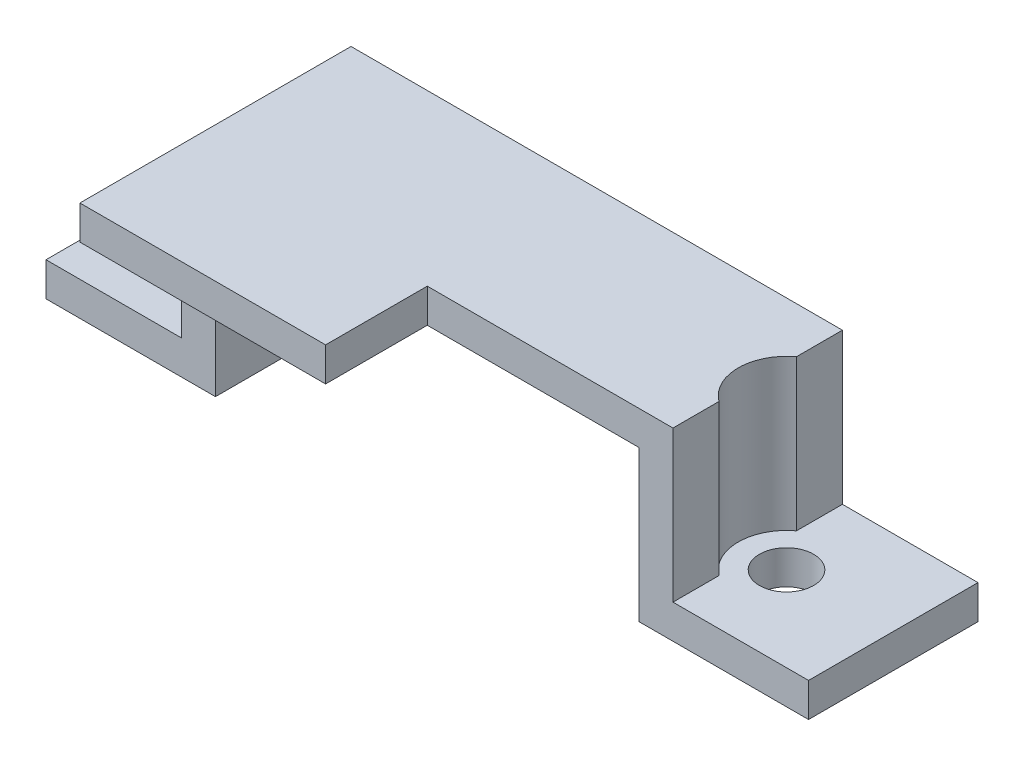
ISO-10303-21;
HEADER;
FILE_DESCRIPTION(('STEP AP214'),'2;1');
FILE_NAME('part.step','',(''),(''),'','','');
FILE_SCHEMA(('AUTOMOTIVE_DESIGN { 1 0 10303 214 1 1 1 1 }'));
ENDSEC;
DATA;
#1=APPLICATION_CONTEXT('core data for automotive mechanical design processes');
#2=APPLICATION_PROTOCOL_DEFINITION('international standard','automotive_design',2000,#1);
#3=PRODUCT_CONTEXT('',#1,'mechanical');
#4=PRODUCT('Part','Part','',(#3));
#5=PRODUCT_RELATED_PRODUCT_CATEGORY('part','',(#4));
#6=PRODUCT_DEFINITION_FORMATION('','',#4);
#7=PRODUCT_DEFINITION_CONTEXT('part definition',#1,'design');
#8=PRODUCT_DEFINITION('design','',#6,#7);
#9=PRODUCT_DEFINITION_SHAPE('','',#8);
#10=(LENGTH_UNIT() NAMED_UNIT(*) SI_UNIT(.MILLI.,.METRE.));
#11=(NAMED_UNIT(*) PLANE_ANGLE_UNIT() SI_UNIT($,.RADIAN.));
#12=(NAMED_UNIT(*) SI_UNIT($,.STERADIAN.) SOLID_ANGLE_UNIT());
#13=UNCERTAINTY_MEASURE_WITH_UNIT(LENGTH_MEASURE(1.E-05),#10,'distance_accuracy_value','');
#14=(GEOMETRIC_REPRESENTATION_CONTEXT(3) GLOBAL_UNCERTAINTY_ASSIGNED_CONTEXT((#13)) GLOBAL_UNIT_ASSIGNED_CONTEXT((#10,
#11,#12)) REPRESENTATION_CONTEXT('',''));
#15=CARTESIAN_POINT('',(0.,0.,0.));
#16=DIRECTION('',(0.,0.,1.));
#17=DIRECTION('',(1.,0.,0.));
#18=AXIS2_PLACEMENT_3D('',#15,#16,#17);
#19=CARTESIAN_POINT('',(15.,12.,10.));
#20=DIRECTION('',(1.,0.,0.));
#21=DIRECTION('',(0.,1.,0.));
#22=AXIS2_PLACEMENT_3D('',#19,#20,#21);
#23=PLANE('',#22);
#24=DIRECTION('',(0.,0.,-1.));
#25=VECTOR('',#24,1.);
#26=CARTESIAN_POINT('',(15.,3.1,10.));
#27=LINE('',#26,#25);
#28=CARTESIAN_POINT('',(15.,3.1,10.));
#29=VERTEX_POINT('',#28);
#30=CARTESIAN_POINT('',(15.,3.1,7.28746584673958));
#31=VERTEX_POINT('',#30);
#32=EDGE_CURVE('E174',#29,#31,#27,.T.);
#33=ORIENTED_EDGE('',*,*,#32,.T.);
#34=DIRECTION('',(0.,-1.,0.));
#35=VECTOR('',#34,1.);
#36=CARTESIAN_POINT('',(15.,20.0610173055266,7.28746584673958));
#37=LINE('',#36,#35);
#38=CARTESIAN_POINT('',(15.,12.,7.28746584673958));
#39=VERTEX_POINT('',#38);
#40=EDGE_CURVE('E158',#31,#39,#37,.F.);
#41=ORIENTED_EDGE('',*,*,#40,.T.);
#42=DIRECTION('',(0.,0.,-1.));
#43=VECTOR('',#42,1.);
#44=CARTESIAN_POINT('',(15.,12.,10.));
#45=LINE('',#44,#43);
#46=CARTESIAN_POINT('',(15.,12.,10.));
#47=VERTEX_POINT('',#46);
#48=EDGE_CURVE('E184',#47,#39,#45,.T.);
#49=ORIENTED_EDGE('',*,*,#48,.F.);
#50=DIRECTION('',(0.,-1.,0.));
#51=VECTOR('',#50,1.);
#52=CARTESIAN_POINT('',(15.,12.,10.));
#53=LINE('',#52,#51);
#54=EDGE_CURVE('E181',#47,#29,#53,.T.);
#55=ORIENTED_EDGE('',*,*,#54,.T.);
#56=EDGE_LOOP('',(#33,#41,#49,#55));
#57=FACE_BOUND('',#56,.T.);
#58=ADVANCED_FACE('F39',(#57),#23,.T.);
#59=CARTESIAN_POINT('',(15.,12.,2.71253415326043));
#60=VERTEX_POINT('',#59);
#61=CARTESIAN_POINT('',(15.,12.,0.));
#62=VERTEX_POINT('',#61);
#63=EDGE_CURVE('E187',#60,#62,#45,.T.);
#64=ORIENTED_EDGE('',*,*,#63,.F.);
#65=DIRECTION('',(0.,-1.,0.));
#66=VECTOR('',#65,1.);
#67=CARTESIAN_POINT('',(15.,20.0610173055266,2.71253415326043));
#68=LINE('',#67,#66);
#69=CARTESIAN_POINT('',(15.,3.1,2.71253415326042));
#70=VERTEX_POINT('',#69);
#71=EDGE_CURVE('E55',#60,#70,#68,.T.);
#72=ORIENTED_EDGE('',*,*,#71,.T.);
#73=CARTESIAN_POINT('',(15.,3.1,0.));
#74=VERTEX_POINT('',#73);
#75=EDGE_CURVE('E177',#70,#74,#27,.T.);
#76=ORIENTED_EDGE('',*,*,#75,.T.);
#77=DIRECTION('',(0.,-1.,0.));
#78=VECTOR('',#77,1.);
#79=CARTESIAN_POINT('',(15.,12.,0.));
#80=LINE('',#79,#78);
#81=EDGE_CURVE('E230',#62,#74,#80,.T.);
#82=ORIENTED_EDGE('',*,*,#81,.F.);
#83=EDGE_LOOP('',(#64,#72,#76,#82));
#84=FACE_BOUND('',#83,.T.);
#85=ADVANCED_FACE('F298',(#84),#23,.T.);
#86=CARTESIAN_POINT('',(0.,0.,10.));
#87=DIRECTION('',(0.,0.,-1.));
#88=DIRECTION('',(-1.,0.,0.));
#89=AXIS2_PLACEMENT_3D('',#86,#87,#88);
#90=PLANE('',#89);
#91=DIRECTION('',(1.,0.,0.));
#92=VECTOR('',#91,1.);
#93=CARTESIAN_POINT('',(-14.,10.,10.));
#94=LINE('',#93,#92);
#95=CARTESIAN_POINT('',(-14.,10.,10.));
#96=VERTEX_POINT('',#95);
#97=CARTESIAN_POINT('',(-12.,10.,10.));
#98=VERTEX_POINT('',#97);
#99=EDGE_CURVE('E277',#96,#98,#94,.T.);
#100=ORIENTED_EDGE('',*,*,#99,.F.);
#101=DIRECTION('',(0.,1.,0.));
#102=VECTOR('',#101,1.);
#103=CARTESIAN_POINT('',(-14.,2.1,10.));
#104=LINE('',#103,#102);
#105=CARTESIAN_POINT('',(-14.,2.1,10.));
#106=VERTEX_POINT('',#105);
#107=EDGE_CURVE('E256',#106,#96,#104,.T.);
#108=ORIENTED_EDGE('',*,*,#107,.F.);
#109=DIRECTION('',(1.,0.,0.));
#110=VECTOR('',#109,1.);
#111=CARTESIAN_POINT('',(-22.,2.1,10.));
#112=LINE('',#111,#110);
#113=CARTESIAN_POINT('',(-22.,2.1,10.));
#114=VERTEX_POINT('',#113);
#115=EDGE_CURVE('E253',#114,#106,#112,.T.);
#116=ORIENTED_EDGE('',*,*,#115,.F.);
#117=DIRECTION('',(0.,1.,0.));
#118=VECTOR('',#117,1.);
#119=CARTESIAN_POINT('',(-22.,0.0999999999999994,10.));
#120=LINE('',#119,#118);
#121=CARTESIAN_POINT('',(-22.,0.0999999999999994,10.));
#122=VERTEX_POINT('',#121);
#123=EDGE_CURVE('E250',#122,#114,#120,.T.);
#124=ORIENTED_EDGE('',*,*,#123,.F.);
#125=DIRECTION('',(1.,0.,0.));
#126=VECTOR('',#125,1.);
#127=CARTESIAN_POINT('',(-22.,0.0999999999999994,10.));
#128=LINE('',#127,#126);
#129=CARTESIAN_POINT('',(-12.,0.0999999999999994,10.));
#130=VERTEX_POINT('',#129);
#131=EDGE_CURVE('E248',#122,#130,#128,.T.);
#132=ORIENTED_EDGE('',*,*,#131,.T.);
#133=DIRECTION('',(0.,1.,0.));
#134=VECTOR('',#133,1.);
#135=CARTESIAN_POINT('',(-12.,2.1,10.));
#136=LINE('',#135,#134);
#137=EDGE_CURVE('E245',#130,#98,#136,.T.);
#138=ORIENTED_EDGE('',*,*,#137,.T.);
#139=EDGE_LOOP('',(#100,#108,#116,#124,#132,#138));
#140=FACE_BOUND('',#139,.T.);
#141=ADVANCED_FACE('F348',(#140),#90,.F.);
#142=CARTESIAN_POINT('',(15.,1.1,10.));
#143=DIRECTION('',(0.,1.,0.));
#144=DIRECTION('',(-1.,0.,0.));
#145=AXIS2_PLACEMENT_3D('',#142,#143,#144);
#146=PLANE('',#145);
#147=CARTESIAN_POINT('',(16.7,1.1,5.));
#148=DIRECTION('',(0.,1.,0.));
#149=DIRECTION('',(-1.,0.,0.));
#150=AXIS2_PLACEMENT_3D('',#147,#148,#149);
#151=CIRCLE('',#150,1.60000000000001);
#152=CARTESIAN_POINT('',(15.1,1.1,5.));
#153=VERTEX_POINT('',#152);
#154=EDGE_CURVE('E279',#153,#153,#151,.F.);
#155=ORIENTED_EDGE('',*,*,#154,.F.);
#156=EDGE_LOOP('',(#155));
#157=FACE_BOUND('',#156,.T.);
#158=DIRECTION('',(1.,0.,0.));
#159=VECTOR('',#158,1.);
#160=CARTESIAN_POINT('',(15.,1.1,0.));
#161=LINE('',#160,#159);
#162=CARTESIAN_POINT('',(13.,1.1,0.));
#163=VERTEX_POINT('',#162);
#164=CARTESIAN_POINT('',(23.,1.1,0.));
#165=VERTEX_POINT('',#164);
#166=EDGE_CURVE('E239',#163,#165,#161,.T.);
#167=ORIENTED_EDGE('',*,*,#166,.T.);
#168=DIRECTION('',(0.,0.,-1.));
#169=VECTOR('',#168,1.);
#170=CARTESIAN_POINT('',(23.,1.1,10.));
#171=LINE('',#170,#169);
#172=CARTESIAN_POINT('',(23.,1.1,10.));
#173=VERTEX_POINT('',#172);
#174=EDGE_CURVE('E11',#173,#165,#171,.T.);
#175=ORIENTED_EDGE('',*,*,#174,.F.);
#176=DIRECTION('',(1.,0.,0.));
#177=VECTOR('',#176,1.);
#178=CARTESIAN_POINT('',(15.,1.1,10.));
#179=LINE('',#178,#177);
#180=CARTESIAN_POINT('',(13.,1.1,10.));
#181=VERTEX_POINT('',#180);
#182=EDGE_CURVE('E211',#181,#173,#179,.T.);
#183=ORIENTED_EDGE('',*,*,#182,.F.);
#184=DIRECTION('',(0.,0.,-1.));
#185=VECTOR('',#184,1.);
#186=CARTESIAN_POINT('',(13.,1.1,10.));
#187=LINE('',#186,#185);
#188=EDGE_CURVE('E205',#181,#163,#187,.T.);
#189=ORIENTED_EDGE('',*,*,#188,.T.);
#190=EDGE_LOOP('',(#167,#175,#183,#189));
#191=FACE_BOUND('',#190,.T.);
#192=ADVANCED_FACE('F41',(#157,#191),#146,.F.);
#193=CARTESIAN_POINT('',(23.,3.1,10.));
#194=DIRECTION('',(1.,0.,0.));
#195=DIRECTION('',(0.,0.,-1.));
#196=AXIS2_PLACEMENT_3D('',#193,#194,#195);
#197=PLANE('',#196);
#198=DIRECTION('',(0.,-1.,0.));
#199=VECTOR('',#198,1.);
#200=CARTESIAN_POINT('',(23.,3.1,0.));
#201=LINE('',#200,#199);
#202=CARTESIAN_POINT('',(23.,3.1,0.));
#203=VERTEX_POINT('',#202);
#204=EDGE_CURVE('E236',#203,#165,#201,.T.);
#205=ORIENTED_EDGE('',*,*,#204,.F.);
#206=DIRECTION('',(0.,0.,-1.));
#207=VECTOR('',#206,1.);
#208=CARTESIAN_POINT('',(23.,3.1,10.));
#209=LINE('',#208,#207);
#210=CARTESIAN_POINT('',(23.,3.1,10.));
#211=VERTEX_POINT('',#210);
#212=EDGE_CURVE('E48',#211,#203,#209,.T.);
#213=ORIENTED_EDGE('',*,*,#212,.F.);
#214=DIRECTION('',(0.,-1.,0.));
#215=VECTOR('',#214,1.);
#216=CARTESIAN_POINT('',(23.,3.1,10.));
#217=LINE('',#216,#215);
#218=EDGE_CURVE('E264',#211,#173,#217,.T.);
#219=ORIENTED_EDGE('',*,*,#218,.T.);
#220=ORIENTED_EDGE('',*,*,#174,.T.);
#221=EDGE_LOOP('',(#205,#213,#219,#220));
#222=FACE_BOUND('',#221,.T.);
#223=ADVANCED_FACE('F309',(#222),#197,.T.);
#224=CARTESIAN_POINT('',(15.,3.1,10.));
#225=DIRECTION('',(0.,1.,0.));
#226=DIRECTION('',(-1.,0.,0.));
#227=AXIS2_PLACEMENT_3D('',#224,#225,#226);
#228=PLANE('',#227);
#229=ORIENTED_EDGE('',*,*,#75,.F.);
#230=CARTESIAN_POINT('',(16.7,3.1,5.));
#231=DIRECTION('',(0.,1.,0.));
#232=DIRECTION('',(-1.,0.,0.));
#233=AXIS2_PLACEMENT_3D('',#230,#231,#232);
#234=CIRCLE('',#233,2.85);
#235=EDGE_CURVE('E161',#70,#31,#234,.T.);
#236=ORIENTED_EDGE('',*,*,#235,.T.);
#237=ORIENTED_EDGE('',*,*,#32,.F.);
#238=DIRECTION('',(1.,0.,0.));
#239=VECTOR('',#238,1.);
#240=CARTESIAN_POINT('',(15.,3.1,10.));
#241=LINE('',#240,#239);
#242=EDGE_CURVE('E262',#29,#211,#241,.T.);
#243=ORIENTED_EDGE('',*,*,#242,.T.);
#244=ORIENTED_EDGE('',*,*,#212,.T.);
#245=DIRECTION('',(1.,0.,0.));
#246=VECTOR('',#245,1.);
#247=CARTESIAN_POINT('',(15.,3.1,0.));
#248=LINE('',#247,#246);
#249=EDGE_CURVE('E233',#74,#203,#248,.T.);
#250=ORIENTED_EDGE('',*,*,#249,.F.);
#251=EDGE_LOOP('',(#229,#236,#237,#243,#244,#250));
#252=FACE_BOUND('',#251,.T.);
#253=CARTESIAN_POINT('',(16.7,3.1,5.));
#254=DIRECTION('',(0.,1.,0.));
#255=DIRECTION('',(-1.,0.,0.));
#256=AXIS2_PLACEMENT_3D('',#253,#254,#255);
#257=CIRCLE('',#256,1.60000000000001);
#258=CARTESIAN_POINT('',(15.1,3.1,5.));
#259=VERTEX_POINT('',#258);
#260=EDGE_CURVE('E43',#259,#259,#257,.F.);
#261=ORIENTED_EDGE('',*,*,#260,.T.);
#262=EDGE_LOOP('',(#261));
#263=FACE_BOUND('',#262,.T.);
#264=ADVANCED_FACE('F171',(#252,#263),#228,.T.);
#265=CARTESIAN_POINT('',(-14.,12.,10.));
#266=DIRECTION('',(0.,1.,0.));
#267=DIRECTION('',(0.,0.,1.));
#268=AXIS2_PLACEMENT_3D('',#265,#266,#267);
#269=PLANE('',#268);
#270=ORIENTED_EDGE('',*,*,#48,.T.);
#271=CARTESIAN_POINT('',(16.7,12.,5.));
#272=DIRECTION('',(0.,1.,0.));
#273=DIRECTION('',(0.,0.,1.));
#274=AXIS2_PLACEMENT_3D('',#271,#272,#273);
#275=CIRCLE('',#274,2.85);
#276=EDGE_CURVE('E162',#60,#39,#275,.T.);
#277=ORIENTED_EDGE('',*,*,#276,.F.);
#278=ORIENTED_EDGE('',*,*,#63,.T.);
#279=DIRECTION('',(1.,0.,0.));
#280=VECTOR('',#279,1.);
#281=CARTESIAN_POINT('',(-14.,12.,0.));
#282=LINE('',#281,#280);
#283=CARTESIAN_POINT('',(-14.,12.,0.));
#284=VERTEX_POINT('',#283);
#285=EDGE_CURVE('E227',#284,#62,#282,.T.);
#286=ORIENTED_EDGE('',*,*,#285,.F.);
#287=DIRECTION('',(0.,0.,-1.));
#288=VECTOR('',#287,1.);
#289=CARTESIAN_POINT('',(-14.,12.,10.));
#290=LINE('',#289,#288);
#291=CARTESIAN_POINT('',(-14.,12.,16.));
#292=VERTEX_POINT('',#291);
#293=EDGE_CURVE('E188',#292,#284,#290,.T.);
#294=ORIENTED_EDGE('',*,*,#293,.F.);
#295=DIRECTION('',(1.,0.,0.));
#296=VECTOR('',#295,1.);
#297=CARTESIAN_POINT('',(-14.,12.,16.));
#298=LINE('',#297,#296);
#299=CARTESIAN_POINT('',(0.5,12.,16.));
#300=VERTEX_POINT('',#299);
#301=EDGE_CURVE('E282',#292,#300,#298,.T.);
#302=ORIENTED_EDGE('',*,*,#301,.T.);
#303=DIRECTION('',(0.,0.,-1.));
#304=VECTOR('',#303,1.);
#305=CARTESIAN_POINT('',(0.5,12.,16.));
#306=LINE('',#305,#304);
#307=CARTESIAN_POINT('',(0.5,12.,10.));
#308=VERTEX_POINT('',#307);
#309=EDGE_CURVE('E269',#300,#308,#306,.T.);
#310=ORIENTED_EDGE('',*,*,#309,.T.);
#311=DIRECTION('',(1.,0.,0.));
#312=VECTOR('',#311,1.);
#313=CARTESIAN_POINT('',(-14.,12.,10.));
#314=LINE('',#313,#312);
#315=EDGE_CURVE('E259',#308,#47,#314,.T.);
#316=ORIENTED_EDGE('',*,*,#315,.T.);
#317=EDGE_LOOP('',(#270,#277,#278,#286,#294,#302,#310,#316));
#318=FACE_BOUND('',#317,.T.);
#319=ADVANCED_FACE('F302',(#318),#269,.T.);
#320=CARTESIAN_POINT('',(-14.,2.1,10.));
#321=DIRECTION('',(-1.,0.,0.));
#322=DIRECTION('',(0.,0.,1.));
#323=AXIS2_PLACEMENT_3D('',#320,#321,#322);
#324=PLANE('',#323);
#325=DIRECTION('',(0.,1.,0.));
#326=VECTOR('',#325,1.);
#327=CARTESIAN_POINT('',(-14.,2.1,0.));
#328=LINE('',#327,#326);
#329=CARTESIAN_POINT('',(-14.,2.1,0.));
#330=VERTEX_POINT('',#329);
#331=EDGE_CURVE('E224',#330,#284,#328,.T.);
#332=ORIENTED_EDGE('',*,*,#331,.F.);
#333=DIRECTION('',(0.,0.,-1.));
#334=VECTOR('',#333,1.);
#335=CARTESIAN_POINT('',(-14.,2.1,10.));
#336=LINE('',#335,#334);
#337=EDGE_CURVE('E190',#106,#330,#336,.T.);
#338=ORIENTED_EDGE('',*,*,#337,.F.);
#339=ORIENTED_EDGE('',*,*,#107,.T.);
#340=DIRECTION('',(0.,0.,-1.));
#341=VECTOR('',#340,1.);
#342=CARTESIAN_POINT('',(-14.,10.,16.));
#343=LINE('',#342,#341);
#344=CARTESIAN_POINT('',(-14.,10.,16.));
#345=VERTEX_POINT('',#344);
#346=EDGE_CURVE('E271',#345,#96,#343,.T.);
#347=ORIENTED_EDGE('',*,*,#346,.F.);
#348=DIRECTION('',(0.,1.,0.));
#349=VECTOR('',#348,1.);
#350=CARTESIAN_POINT('',(-14.,10.,16.));
#351=LINE('',#350,#349);
#352=EDGE_CURVE('E273',#345,#292,#351,.T.);
#353=ORIENTED_EDGE('',*,*,#352,.T.);
#354=ORIENTED_EDGE('',*,*,#293,.T.);
#355=EDGE_LOOP('',(#332,#338,#339,#347,#353,#354));
#356=FACE_BOUND('',#355,.T.);
#357=ADVANCED_FACE('F317',(#356),#324,.T.);
#358=CARTESIAN_POINT('',(-22.,2.1,10.));
#359=DIRECTION('',(0.,1.,0.));
#360=DIRECTION('',(0.,0.,1.));
#361=AXIS2_PLACEMENT_3D('',#358,#359,#360);
#362=PLANE('',#361);
#363=CARTESIAN_POINT('',(-18.,2.1,5.));
#364=DIRECTION('',(0.,1.,0.));
#365=DIRECTION('',(0.,0.,1.));
#366=AXIS2_PLACEMENT_3D('',#363,#364,#365);
#367=CIRCLE('',#366,1.6);
#368=CARTESIAN_POINT('',(-18.,2.1,6.6));
#369=VERTEX_POINT('',#368);
#370=EDGE_CURVE('E290',#369,#369,#367,.F.);
#371=ORIENTED_EDGE('',*,*,#370,.T.);
#372=EDGE_LOOP('',(#371));
#373=FACE_BOUND('',#372,.T.);
#374=DIRECTION('',(1.,0.,0.));
#375=VECTOR('',#374,1.);
#376=CARTESIAN_POINT('',(-22.,2.1,0.));
#377=LINE('',#376,#375);
#378=CARTESIAN_POINT('',(-22.,2.1,0.));
#379=VERTEX_POINT('',#378);
#380=EDGE_CURVE('E221',#379,#330,#377,.T.);
#381=ORIENTED_EDGE('',*,*,#380,.F.);
#382=DIRECTION('',(0.,0.,-1.));
#383=VECTOR('',#382,1.);
#384=CARTESIAN_POINT('',(-22.,2.1,10.));
#385=LINE('',#384,#383);
#386=EDGE_CURVE('E192',#114,#379,#385,.T.);
#387=ORIENTED_EDGE('',*,*,#386,.F.);
#388=ORIENTED_EDGE('',*,*,#115,.T.);
#389=ORIENTED_EDGE('',*,*,#337,.T.);
#390=EDGE_LOOP('',(#381,#387,#388,#389));
#391=FACE_BOUND('',#390,.T.);
#392=ADVANCED_FACE('F357',(#373,#391),#362,.T.);
#393=CARTESIAN_POINT('',(-22.,0.0999999999999994,10.));
#394=DIRECTION('',(-1.,0.,0.));
#395=DIRECTION('',(0.,0.,1.));
#396=AXIS2_PLACEMENT_3D('',#393,#394,#395);
#397=PLANE('',#396);
#398=DIRECTION('',(0.,1.,0.));
#399=VECTOR('',#398,1.);
#400=CARTESIAN_POINT('',(-22.,0.0999999999999994,0.));
#401=LINE('',#400,#399);
#402=CARTESIAN_POINT('',(-22.,0.0999999999999994,0.));
#403=VERTEX_POINT('',#402);
#404=EDGE_CURVE('E218',#403,#379,#401,.T.);
#405=ORIENTED_EDGE('',*,*,#404,.F.);
#406=DIRECTION('',(0.,0.,-1.));
#407=VECTOR('',#406,1.);
#408=CARTESIAN_POINT('',(-22.,0.0999999999999994,10.));
#409=LINE('',#408,#407);
#410=EDGE_CURVE('E194',#122,#403,#409,.T.);
#411=ORIENTED_EDGE('',*,*,#410,.F.);
#412=ORIENTED_EDGE('',*,*,#123,.T.);
#413=ORIENTED_EDGE('',*,*,#386,.T.);
#414=EDGE_LOOP('',(#405,#411,#412,#413));
#415=FACE_BOUND('',#414,.T.);
#416=ADVANCED_FACE('F355',(#415),#397,.T.);
#417=CARTESIAN_POINT('',(-22.,0.0999999999999994,10.));
#418=DIRECTION('',(0.,1.,0.));
#419=DIRECTION('',(0.,0.,1.));
#420=AXIS2_PLACEMENT_3D('',#417,#418,#419);
#421=PLANE('',#420);
#422=CARTESIAN_POINT('',(-18.,0.0999999999999994,5.));
#423=DIRECTION('',(0.,1.,0.));
#424=DIRECTION('',(0.,0.,1.));
#425=AXIS2_PLACEMENT_3D('',#422,#423,#424);
#426=CIRCLE('',#425,1.6);
#427=CARTESIAN_POINT('',(-18.,0.0999999999999994,6.6));
#428=VERTEX_POINT('',#427);
#429=EDGE_CURVE('E167',#428,#428,#426,.T.);
#430=ORIENTED_EDGE('',*,*,#429,.T.);
#431=EDGE_LOOP('',(#430));
#432=FACE_BOUND('',#431,.T.);
#433=DIRECTION('',(1.,0.,0.));
#434=VECTOR('',#433,1.);
#435=CARTESIAN_POINT('',(-22.,0.0999999999999994,0.));
#436=LINE('',#435,#434);
#437=CARTESIAN_POINT('',(-12.,0.0999999999999994,0.));
#438=VERTEX_POINT('',#437);
#439=EDGE_CURVE('E216',#403,#438,#436,.T.);
#440=ORIENTED_EDGE('',*,*,#439,.T.);
#441=DIRECTION('',(0.,0.,-1.));
#442=VECTOR('',#441,1.);
#443=CARTESIAN_POINT('',(-12.,0.0999999999999994,10.));
#444=LINE('',#443,#442);
#445=EDGE_CURVE('E196',#130,#438,#444,.T.);
#446=ORIENTED_EDGE('',*,*,#445,.F.);
#447=ORIENTED_EDGE('',*,*,#131,.F.);
#448=ORIENTED_EDGE('',*,*,#410,.T.);
#449=EDGE_LOOP('',(#440,#446,#447,#448));
#450=FACE_BOUND('',#449,.T.);
#451=ADVANCED_FACE('F353',(#432,#450),#421,.F.);
#452=CARTESIAN_POINT('',(-12.,2.1,10.));
#453=DIRECTION('',(-1.,0.,0.));
#454=DIRECTION('',(0.,0.,1.));
#455=AXIS2_PLACEMENT_3D('',#452,#453,#454);
#456=PLANE('',#455);
#457=DIRECTION('',(0.,1.,0.));
#458=VECTOR('',#457,1.);
#459=CARTESIAN_POINT('',(-12.,2.1,0.));
#460=LINE('',#459,#458);
#461=CARTESIAN_POINT('',(-12.,10.,0.));
#462=VERTEX_POINT('',#461);
#463=EDGE_CURVE('E214',#438,#462,#460,.T.);
#464=ORIENTED_EDGE('',*,*,#463,.T.);
#465=DIRECTION('',(0.,0.,-1.));
#466=VECTOR('',#465,1.);
#467=CARTESIAN_POINT('',(-12.,10.,10.));
#468=LINE('',#467,#466);
#469=EDGE_CURVE('E199',#98,#462,#468,.T.);
#470=ORIENTED_EDGE('',*,*,#469,.F.);
#471=ORIENTED_EDGE('',*,*,#137,.F.);
#472=ORIENTED_EDGE('',*,*,#445,.T.);
#473=EDGE_LOOP('',(#464,#470,#471,#472));
#474=FACE_BOUND('',#473,.T.);
#475=ADVANCED_FACE('F343',(#474),#456,.F.);
#476=CARTESIAN_POINT('',(-14.,10.,10.));
#477=DIRECTION('',(0.,1.,0.));
#478=DIRECTION('',(0.,0.,1.));
#479=AXIS2_PLACEMENT_3D('',#476,#477,#478);
#480=PLANE('',#479);
#481=DIRECTION('',(1.,0.,0.));
#482=VECTOR('',#481,1.);
#483=CARTESIAN_POINT('',(-14.,10.,0.));
#484=LINE('',#483,#482);
#485=CARTESIAN_POINT('',(13.,10.,0.));
#486=VERTEX_POINT('',#485);
#487=EDGE_CURVE('E212',#462,#486,#484,.T.);
#488=ORIENTED_EDGE('',*,*,#487,.T.);
#489=DIRECTION('',(0.,0.,-1.));
#490=VECTOR('',#489,1.);
#491=CARTESIAN_POINT('',(13.,10.,10.));
#492=LINE('',#491,#490);
#493=CARTESIAN_POINT('',(13.,10.,10.));
#494=VERTEX_POINT('',#493);
#495=EDGE_CURVE('E202',#494,#486,#492,.T.);
#496=ORIENTED_EDGE('',*,*,#495,.F.);
#497=DIRECTION('',(1.,0.,0.));
#498=VECTOR('',#497,1.);
#499=CARTESIAN_POINT('',(-14.,10.,10.));
#500=LINE('',#499,#498);
#501=CARTESIAN_POINT('',(0.5,10.,10.));
#502=VERTEX_POINT('',#501);
#503=EDGE_CURVE('E243',#502,#494,#500,.T.);
#504=ORIENTED_EDGE('',*,*,#503,.F.);
#505=DIRECTION('',(0.,0.,-1.));
#506=VECTOR('',#505,1.);
#507=CARTESIAN_POINT('',(0.5,10.,16.));
#508=LINE('',#507,#506);
#509=CARTESIAN_POINT('',(0.5,10.,16.));
#510=VERTEX_POINT('',#509);
#511=EDGE_CURVE('E63',#510,#502,#508,.T.);
#512=ORIENTED_EDGE('',*,*,#511,.F.);
#513=DIRECTION('',(1.,0.,0.));
#514=VECTOR('',#513,1.);
#515=CARTESIAN_POINT('',(-14.,10.,16.));
#516=LINE('',#515,#514);
#517=EDGE_CURVE('E276',#345,#510,#516,.T.);
#518=ORIENTED_EDGE('',*,*,#517,.F.);
#519=ORIENTED_EDGE('',*,*,#346,.T.);
#520=ORIENTED_EDGE('',*,*,#99,.T.);
#521=ORIENTED_EDGE('',*,*,#469,.T.);
#522=EDGE_LOOP('',(#488,#496,#504,#512,#518,#519,#520,#521));
#523=FACE_BOUND('',#522,.T.);
#524=ADVANCED_FACE('F329',(#523),#480,.F.);
#525=CARTESIAN_POINT('',(13.,12.,10.));
#526=DIRECTION('',(1.,0.,0.));
#527=DIRECTION('',(0.,1.,0.));
#528=AXIS2_PLACEMENT_3D('',#525,#526,#527);
#529=PLANE('',#528);
#530=DIRECTION('',(0.,-1.,0.));
#531=VECTOR('',#530,1.);
#532=CARTESIAN_POINT('',(13.,12.,0.));
#533=LINE('',#532,#531);
#534=EDGE_CURVE('E209',#486,#163,#533,.T.);
#535=ORIENTED_EDGE('',*,*,#534,.T.);
#536=ORIENTED_EDGE('',*,*,#188,.F.);
#537=DIRECTION('',(0.,-1.,0.));
#538=VECTOR('',#537,1.);
#539=CARTESIAN_POINT('',(13.,12.,10.));
#540=LINE('',#539,#538);
#541=EDGE_CURVE('E208',#494,#181,#540,.T.);
#542=ORIENTED_EDGE('',*,*,#541,.F.);
#543=ORIENTED_EDGE('',*,*,#495,.T.);
#544=EDGE_LOOP('',(#535,#536,#542,#543));
#545=FACE_BOUND('',#544,.T.);
#546=ADVANCED_FACE('F335',(#545),#529,.F.);
#547=ORIENTED_EDGE('',*,*,#315,.F.);
#548=DIRECTION('',(0.,-1.,0.));
#549=VECTOR('',#548,1.);
#550=CARTESIAN_POINT('',(0.5,12.,10.));
#551=LINE('',#550,#549);
#552=EDGE_CURVE('E274',#308,#502,#551,.T.);
#553=ORIENTED_EDGE('',*,*,#552,.T.);
#554=ORIENTED_EDGE('',*,*,#503,.T.);
#555=ORIENTED_EDGE('',*,*,#541,.T.);
#556=ORIENTED_EDGE('',*,*,#182,.T.);
#557=ORIENTED_EDGE('',*,*,#218,.F.);
#558=ORIENTED_EDGE('',*,*,#242,.F.);
#559=ORIENTED_EDGE('',*,*,#54,.F.);
#560=EDGE_LOOP('',(#547,#553,#554,#555,#556,#557,#558,#559));
#561=FACE_BOUND('',#560,.T.);
#562=ADVANCED_FACE('F305',(#561),#90,.F.);
#563=CARTESIAN_POINT('',(0.,0.,0.));
#564=DIRECTION('',(0.,0.,-1.));
#565=DIRECTION('',(-1.,0.,0.));
#566=AXIS2_PLACEMENT_3D('',#563,#564,#565);
#567=PLANE('',#566);
#568=ORIENTED_EDGE('',*,*,#166,.F.);
#569=ORIENTED_EDGE('',*,*,#534,.F.);
#570=ORIENTED_EDGE('',*,*,#487,.F.);
#571=ORIENTED_EDGE('',*,*,#463,.F.);
#572=ORIENTED_EDGE('',*,*,#439,.F.);
#573=ORIENTED_EDGE('',*,*,#404,.T.);
#574=ORIENTED_EDGE('',*,*,#380,.T.);
#575=ORIENTED_EDGE('',*,*,#331,.T.);
#576=ORIENTED_EDGE('',*,*,#285,.T.);
#577=ORIENTED_EDGE('',*,*,#81,.T.);
#578=ORIENTED_EDGE('',*,*,#249,.T.);
#579=ORIENTED_EDGE('',*,*,#204,.T.);
#580=EDGE_LOOP('',(#568,#569,#570,#571,#572,#573,#574,#575,#576,#577,#578,#579));
#581=FACE_BOUND('',#580,.T.);
#582=ADVANCED_FACE('F313',(#581),#567,.T.);
#583=CARTESIAN_POINT('',(0.5,12.,16.));
#584=DIRECTION('',(1.,0.,0.));
#585=DIRECTION('',(0.,0.,-1.));
#586=AXIS2_PLACEMENT_3D('',#583,#584,#585);
#587=PLANE('',#586);
#588=ORIENTED_EDGE('',*,*,#552,.F.);
#589=ORIENTED_EDGE('',*,*,#309,.F.);
#590=DIRECTION('',(0.,-1.,0.));
#591=VECTOR('',#590,1.);
#592=CARTESIAN_POINT('',(0.5,12.,16.));
#593=LINE('',#592,#591);
#594=EDGE_CURVE('E285',#300,#510,#593,.T.);
#595=ORIENTED_EDGE('',*,*,#594,.T.);
#596=ORIENTED_EDGE('',*,*,#511,.T.);
#597=EDGE_LOOP('',(#588,#589,#595,#596));
#598=FACE_BOUND('',#597,.T.);
#599=ADVANCED_FACE('F325',(#598),#587,.T.);
#600=CARTESIAN_POINT('',(0.,0.,16.));
#601=DIRECTION('',(0.,0.,-1.));
#602=DIRECTION('',(-1.,0.,0.));
#603=AXIS2_PLACEMENT_3D('',#600,#601,#602);
#604=PLANE('',#603);
#605=ORIENTED_EDGE('',*,*,#517,.T.);
#606=ORIENTED_EDGE('',*,*,#594,.F.);
#607=ORIENTED_EDGE('',*,*,#301,.F.);
#608=ORIENTED_EDGE('',*,*,#352,.F.);
#609=EDGE_LOOP('',(#605,#606,#607,#608));
#610=FACE_BOUND('',#609,.T.);
#611=ADVANCED_FACE('F323',(#610),#604,.F.);
#612=CARTESIAN_POINT('',(-18.,6.1,5.));
#613=DIRECTION('',(0.,-1.,0.));
#614=DIRECTION('',(0.,0.,-1.));
#615=AXIS2_PLACEMENT_3D('',#612,#613,#614);
#616=CYLINDRICAL_SURFACE('',#615,1.6);
#617=ORIENTED_EDGE('',*,*,#370,.F.);
#618=EDGE_LOOP('',(#617));
#619=FACE_BOUND('',#618,.T.);
#620=ORIENTED_EDGE('',*,*,#429,.F.);
#621=EDGE_LOOP('',(#620));
#622=FACE_BOUND('',#621,.T.);
#623=ADVANCED_FACE('F388',(#619,#622),#616,.F.);
#624=CARTESIAN_POINT('',(16.7,6.1,5.));
#625=DIRECTION('',(0.,-1.,0.));
#626=DIRECTION('',(0.,0.,-1.));
#627=AXIS2_PLACEMENT_3D('',#624,#625,#626);
#628=CYLINDRICAL_SURFACE('',#627,1.60000000000001);
#629=ORIENTED_EDGE('',*,*,#260,.F.);
#630=EDGE_LOOP('',(#629));
#631=FACE_BOUND('',#630,.T.);
#632=ORIENTED_EDGE('',*,*,#154,.T.);
#633=EDGE_LOOP('',(#632));
#634=FACE_BOUND('',#633,.T.);
#635=ADVANCED_FACE('F386',(#631,#634),#628,.F.);
#636=CARTESIAN_POINT('',(16.7,20.0610173055266,5.));
#637=DIRECTION('',(0.,-1.,0.));
#638=DIRECTION('',(1.,0.,0.));
#639=AXIS2_PLACEMENT_3D('',#636,#637,#638);
#640=CYLINDRICAL_SURFACE('',#639,2.85);
#641=ORIENTED_EDGE('',*,*,#235,.F.);
#642=ORIENTED_EDGE('',*,*,#71,.F.);
#643=ORIENTED_EDGE('',*,*,#276,.T.);
#644=ORIENTED_EDGE('',*,*,#40,.F.);
#645=EDGE_LOOP('',(#641,#642,#643,#644));
#646=FACE_BOUND('',#645,.T.);
#647=ADVANCED_FACE('F160',(#646),#640,.F.);
#648=CLOSED_SHELL('',(#58,#85,#141,#192,#223,#264,#319,#357,#392,#416,#451,#475,#524,#546,#562,
#582,#599,#611,#623,#635,#647));
#649=MANIFOLD_SOLID_BREP('B2',#648);
#650=ADVANCED_BREP_SHAPE_REPRESENTATION('',(#18,#649),#14);
#651=SHAPE_DEFINITION_REPRESENTATION(#9,#650);
ENDSEC;
END-ISO-10303-21;
